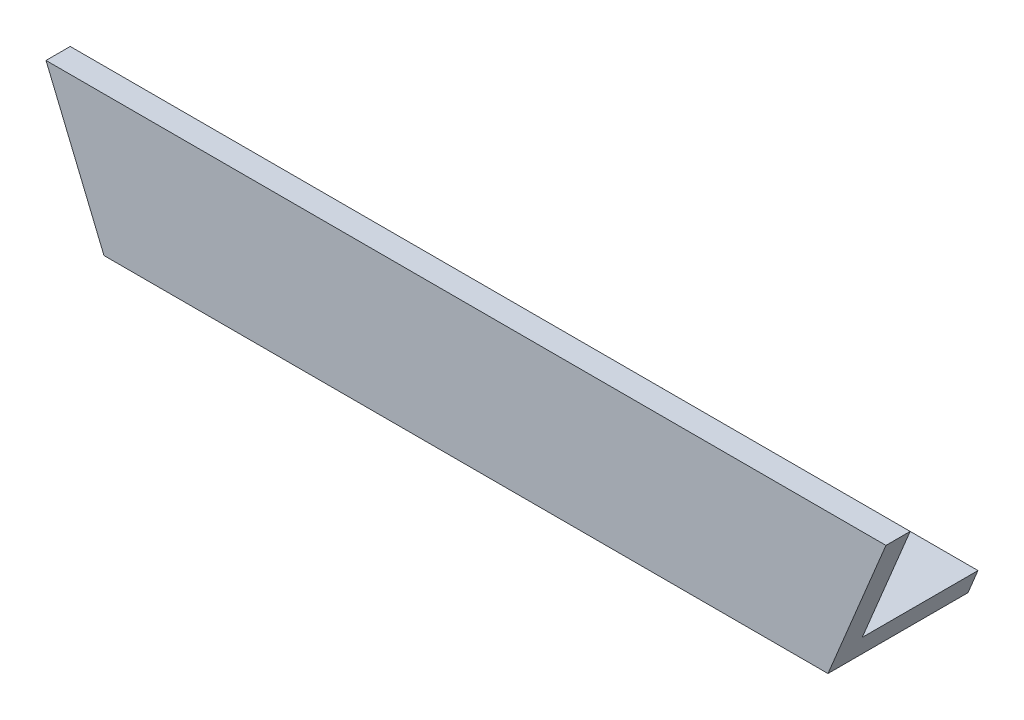
ISO-10303-21;
HEADER;
FILE_DESCRIPTION(('STEP AP214'),'2;1');
FILE_NAME('part.step','',(''),(''),'','','');
FILE_SCHEMA(('AUTOMOTIVE_DESIGN { 1 0 10303 214 1 1 1 1 }'));
ENDSEC;
DATA;
#1=APPLICATION_CONTEXT('core data for automotive mechanical design processes');
#2=APPLICATION_PROTOCOL_DEFINITION('international standard','automotive_design',2000,#1);
#3=PRODUCT_CONTEXT('',#1,'mechanical');
#4=PRODUCT('Part','Part','',(#3));
#5=PRODUCT_RELATED_PRODUCT_CATEGORY('part','',(#4));
#6=PRODUCT_DEFINITION_FORMATION('','',#4);
#7=PRODUCT_DEFINITION_CONTEXT('part definition',#1,'design');
#8=PRODUCT_DEFINITION('design','',#6,#7);
#9=PRODUCT_DEFINITION_SHAPE('','',#8);
#10=(LENGTH_UNIT() NAMED_UNIT(*) SI_UNIT(.MILLI.,.METRE.));
#11=(NAMED_UNIT(*) PLANE_ANGLE_UNIT() SI_UNIT($,.RADIAN.));
#12=(NAMED_UNIT(*) SI_UNIT($,.STERADIAN.) SOLID_ANGLE_UNIT());
#13=UNCERTAINTY_MEASURE_WITH_UNIT(LENGTH_MEASURE(1.E-05),#10,'distance_accuracy_value','');
#14=(GEOMETRIC_REPRESENTATION_CONTEXT(3) GLOBAL_UNCERTAINTY_ASSIGNED_CONTEXT((#13)) GLOBAL_UNIT_ASSIGNED_CONTEXT((#10,
#11,#12)) REPRESENTATION_CONTEXT('',''));
#15=CARTESIAN_POINT('',(0.,0.,0.));
#16=DIRECTION('',(0.,0.,1.));
#17=DIRECTION('',(1.,0.,0.));
#18=AXIS2_PLACEMENT_3D('',#15,#16,#17);
#19=CARTESIAN_POINT('',(120.,20.,0.));
#20=DIRECTION('',(0.,0.,-1.));
#21=DIRECTION('',(0.,1.,0.));
#22=AXIS2_PLACEMENT_3D('',#19,#20,#21);
#23=PLANE('',#22);
#24=DIRECTION('',(0.382683432365091,0.923879532511286,0.));
#25=VECTOR('',#24,1.);
#26=CARTESIAN_POINT('',(120.,20.,0.));
#27=LINE('',#26,#25);
#28=CARTESIAN_POINT('',(111.715728752538,0.,0.));
#29=VERTEX_POINT('',#28);
#30=CARTESIAN_POINT('',(120.,20.,0.));
#31=VERTEX_POINT('',#30);
#32=EDGE_CURVE('E89',#29,#31,#27,.T.);
#33=ORIENTED_EDGE('',*,*,#32,.T.);
#34=DIRECTION('',(-1.,0.,0.));
#35=VECTOR('',#34,1.);
#36=CARTESIAN_POINT('',(120.,20.,0.));
#37=LINE('',#36,#35);
#38=CARTESIAN_POINT('',(0.,20.,0.));
#39=VERTEX_POINT('',#38);
#40=EDGE_CURVE('E114',#31,#39,#37,.T.);
#41=ORIENTED_EDGE('',*,*,#40,.T.);
#42=DIRECTION('',(0.382683432365091,-0.923879532511286,0.));
#43=VECTOR('',#42,1.);
#44=CARTESIAN_POINT('',(0.,20.,0.));
#45=LINE('',#44,#43);
#46=CARTESIAN_POINT('',(8.28427124746192,0.,0.));
#47=VERTEX_POINT('',#46);
#48=EDGE_CURVE('E130',#39,#47,#45,.T.);
#49=ORIENTED_EDGE('',*,*,#48,.T.);
#50=DIRECTION('',(-1.,0.,0.));
#51=VECTOR('',#50,1.);
#52=CARTESIAN_POINT('',(120.,0.,0.));
#53=LINE('',#52,#51);
#54=EDGE_CURVE('E11',#29,#47,#53,.T.);
#55=ORIENTED_EDGE('',*,*,#54,.F.);
#56=EDGE_LOOP('',(#33,#41,#49,#55));
#57=FACE_BOUND('',#56,.T.);
#58=ADVANCED_FACE('F37',(#57),#23,.F.);
#59=CARTESIAN_POINT('',(120.,0.,0.));
#60=DIRECTION('',(0.,1.,0.));
#61=DIRECTION('',(0.,0.,1.));
#62=AXIS2_PLACEMENT_3D('',#59,#60,#61);
#63=PLANE('',#62);
#64=DIRECTION('',(0.,0.,1.));
#65=VECTOR('',#64,1.);
#66=CARTESIAN_POINT('',(111.715728752538,0.,-20.));
#67=LINE('',#66,#65);
#68=CARTESIAN_POINT('',(111.715728752538,0.,-20.));
#69=VERTEX_POINT('',#68);
#70=EDGE_CURVE('E83',#69,#29,#67,.T.);
#71=ORIENTED_EDGE('',*,*,#70,.T.);
#72=ORIENTED_EDGE('',*,*,#54,.T.);
#73=DIRECTION('',(0.,0.,1.));
#74=VECTOR('',#73,1.);
#75=CARTESIAN_POINT('',(8.28427124746192,0.,-20.));
#76=LINE('',#75,#74);
#77=CARTESIAN_POINT('',(8.28427124746192,0.,-20.));
#78=VERTEX_POINT('',#77);
#79=EDGE_CURVE('E105',#78,#47,#76,.T.);
#80=ORIENTED_EDGE('',*,*,#79,.F.);
#81=DIRECTION('',(-1.,0.,0.));
#82=VECTOR('',#81,1.);
#83=CARTESIAN_POINT('',(120.,0.,-20.));
#84=LINE('',#83,#82);
#85=EDGE_CURVE('E45',#69,#78,#84,.T.);
#86=ORIENTED_EDGE('',*,*,#85,.F.);
#87=EDGE_LOOP('',(#71,#72,#80,#86));
#88=FACE_BOUND('',#87,.T.);
#89=ADVANCED_FACE('F104',(#88),#63,.F.);
#90=CARTESIAN_POINT('',(120.,0.,-20.));
#91=DIRECTION('',(0.,0.,1.));
#92=DIRECTION('',(1.,0.,0.));
#93=AXIS2_PLACEMENT_3D('',#90,#91,#92);
#94=PLANE('',#93);
#95=DIRECTION('',(0.382683432365091,0.923879532511286,0.));
#96=VECTOR('',#95,1.);
#97=CARTESIAN_POINT('',(120.,20.,-20.));
#98=LINE('',#97,#96);
#99=CARTESIAN_POINT('',(113.14939581537,3.46117846701572,-20.));
#100=VERTEX_POINT('',#99);
#101=EDGE_CURVE('E86',#69,#100,#98,.T.);
#102=ORIENTED_EDGE('',*,*,#101,.F.);
#103=ORIENTED_EDGE('',*,*,#85,.T.);
#104=DIRECTION('',(0.382683432365091,-0.923879532511286,0.));
#105=VECTOR('',#104,1.);
#106=CARTESIAN_POINT('',(0.,20.,-20.));
#107=LINE('',#106,#105);
#108=CARTESIAN_POINT('',(6.85060418463029,3.46117846701572,-20.));
#109=VERTEX_POINT('',#108);
#110=EDGE_CURVE('E128',#109,#78,#107,.T.);
#111=ORIENTED_EDGE('',*,*,#110,.F.);
#112=DIRECTION('',(-1.,0.,0.));
#113=VECTOR('',#112,1.);
#114=CARTESIAN_POINT('',(120.,3.46117846701572,-20.));
#115=LINE('',#114,#113);
#116=EDGE_CURVE('E101',#100,#109,#115,.T.);
#117=ORIENTED_EDGE('',*,*,#116,.F.);
#118=EDGE_LOOP('',(#102,#103,#111,#117));
#119=FACE_BOUND('',#118,.T.);
#120=ADVANCED_FACE('F98',(#119),#94,.F.);
#121=CARTESIAN_POINT('',(120.,3.46117846701572,-20.));
#122=DIRECTION('',(0.,-1.,0.));
#123=DIRECTION('',(0.,0.,-1.));
#124=AXIS2_PLACEMENT_3D('',#121,#122,#123);
#125=PLANE('',#124);
#126=DIRECTION('',(0.,0.,1.));
#127=VECTOR('',#126,1.);
#128=CARTESIAN_POINT('',(113.14939581537,3.46117846701572,-20.));
#129=LINE('',#128,#127);
#130=CARTESIAN_POINT('',(113.14939581537,3.46117846701572,-3.46117846701572));
#131=VERTEX_POINT('',#130);
#132=EDGE_CURVE('E121',#100,#131,#129,.T.);
#133=ORIENTED_EDGE('',*,*,#132,.F.);
#134=ORIENTED_EDGE('',*,*,#116,.T.);
#135=DIRECTION('',(0.,0.,-1.));
#136=VECTOR('',#135,1.);
#137=CARTESIAN_POINT('',(6.85060418463029,3.46117846701572,-20.));
#138=LINE('',#137,#136);
#139=CARTESIAN_POINT('',(6.8506041846303,3.46117846701572,-3.46117846701572));
#140=VERTEX_POINT('',#139);
#141=EDGE_CURVE('E125',#140,#109,#138,.T.);
#142=ORIENTED_EDGE('',*,*,#141,.F.);
#143=DIRECTION('',(-1.,0.,0.));
#144=VECTOR('',#143,1.);
#145=CARTESIAN_POINT('',(120.,3.46117846701572,-3.46117846701572));
#146=LINE('',#145,#144);
#147=EDGE_CURVE('E106',#131,#140,#146,.T.);
#148=ORIENTED_EDGE('',*,*,#147,.F.);
#149=EDGE_LOOP('',(#133,#134,#142,#148));
#150=FACE_BOUND('',#149,.T.);
#151=ADVANCED_FACE('F147',(#150),#125,.F.);
#152=CARTESIAN_POINT('',(120.,3.46117846701572,-3.46117846701572));
#153=DIRECTION('',(0.,0.,1.));
#154=DIRECTION('',(1.,0.,0.));
#155=AXIS2_PLACEMENT_3D('',#152,#153,#154);
#156=PLANE('',#155);
#157=DIRECTION('',(0.382683432365091,0.923879532511286,0.));
#158=VECTOR('',#157,1.);
#159=CARTESIAN_POINT('',(114.152643570596,5.88323280410424,-3.46117846701572));
#160=LINE('',#159,#158);
#161=CARTESIAN_POINT('',(120.,20.,-3.46117846701572));
#162=VERTEX_POINT('',#161);
#163=EDGE_CURVE('E51',#131,#162,#160,.T.);
#164=ORIENTED_EDGE('',*,*,#163,.F.);
#165=ORIENTED_EDGE('',*,*,#147,.T.);
#166=DIRECTION('',(0.382683432365091,-0.923879532511287,0.));
#167=VECTOR('',#166,1.);
#168=CARTESIAN_POINT('',(23.4209495582109,-36.5431740670887,-3.46117846701572));
#169=LINE('',#168,#167);
#170=CARTESIAN_POINT('',(0.,20.,-3.46117846701572));
#171=VERTEX_POINT('',#170);
#172=EDGE_CURVE('E93',#171,#140,#169,.T.);
#173=ORIENTED_EDGE('',*,*,#172,.F.);
#174=DIRECTION('',(-1.,0.,0.));
#175=VECTOR('',#174,1.);
#176=CARTESIAN_POINT('',(120.,20.,-3.46117846701572));
#177=LINE('',#176,#175);
#178=EDGE_CURVE('E111',#162,#171,#177,.T.);
#179=ORIENTED_EDGE('',*,*,#178,.F.);
#180=EDGE_LOOP('',(#164,#165,#173,#179));
#181=FACE_BOUND('',#180,.T.);
#182=ADVANCED_FACE('F144',(#181),#156,.F.);
#183=CARTESIAN_POINT('',(120.,20.,-3.46117846701572));
#184=DIRECTION('',(0.,-1.,0.));
#185=DIRECTION('',(0.,0.,-1.));
#186=AXIS2_PLACEMENT_3D('',#183,#184,#185);
#187=PLANE('',#186);
#188=DIRECTION('',(0.,0.,1.));
#189=VECTOR('',#188,1.);
#190=CARTESIAN_POINT('',(0.,20.,-3.46117846701572));
#191=LINE('',#190,#189);
#192=EDGE_CURVE('E118',#171,#39,#191,.T.);
#193=ORIENTED_EDGE('',*,*,#192,.T.);
#194=ORIENTED_EDGE('',*,*,#40,.F.);
#195=DIRECTION('',(0.,0.,1.));
#196=VECTOR('',#195,1.);
#197=CARTESIAN_POINT('',(120.,20.,-3.46117846701572));
#198=LINE('',#197,#196);
#199=EDGE_CURVE('E117',#162,#31,#198,.T.);
#200=ORIENTED_EDGE('',*,*,#199,.F.);
#201=ORIENTED_EDGE('',*,*,#178,.T.);
#202=EDGE_LOOP('',(#193,#194,#200,#201));
#203=FACE_BOUND('',#202,.T.);
#204=ADVANCED_FACE('F138',(#203),#187,.F.);
#205=CARTESIAN_POINT('',(0.,20.,-20.));
#206=DIRECTION('',(-0.923879532511287,-0.382683432365091,0.));
#207=DIRECTION('',(0.382683432365091,-0.923879532511287,0.));
#208=AXIS2_PLACEMENT_3D('',#205,#206,#207);
#209=PLANE('',#208);
#210=ORIENTED_EDGE('',*,*,#141,.T.);
#211=ORIENTED_EDGE('',*,*,#110,.T.);
#212=ORIENTED_EDGE('',*,*,#79,.T.);
#213=ORIENTED_EDGE('',*,*,#48,.F.);
#214=ORIENTED_EDGE('',*,*,#192,.F.);
#215=ORIENTED_EDGE('',*,*,#172,.T.);
#216=EDGE_LOOP('',(#210,#211,#212,#213,#214,#215));
#217=FACE_BOUND('',#216,.T.);
#218=ADVANCED_FACE('F141',(#217),#209,.T.);
#219=CARTESIAN_POINT('',(120.,20.,-20.));
#220=DIRECTION('',(0.923879532511286,-0.382683432365091,0.));
#221=DIRECTION('',(0.382683432365091,0.923879532511286,0.));
#222=AXIS2_PLACEMENT_3D('',#219,#220,#221);
#223=PLANE('',#222);
#224=ORIENTED_EDGE('',*,*,#132,.T.);
#225=ORIENTED_EDGE('',*,*,#163,.T.);
#226=ORIENTED_EDGE('',*,*,#199,.T.);
#227=ORIENTED_EDGE('',*,*,#32,.F.);
#228=ORIENTED_EDGE('',*,*,#70,.F.);
#229=ORIENTED_EDGE('',*,*,#101,.T.);
#230=EDGE_LOOP('',(#224,#225,#226,#227,#228,#229));
#231=FACE_BOUND('',#230,.T.);
#232=ADVANCED_FACE('F85',(#231),#223,.T.);
#233=CLOSED_SHELL('',(#58,#89,#120,#151,#182,#204,#218,#232));
#234=MANIFOLD_SOLID_BREP('B2',#233);
#235=ADVANCED_BREP_SHAPE_REPRESENTATION('',(#18,#234),#14);
#236=SHAPE_DEFINITION_REPRESENTATION(#9,#235);
ENDSEC;
END-ISO-10303-21;
